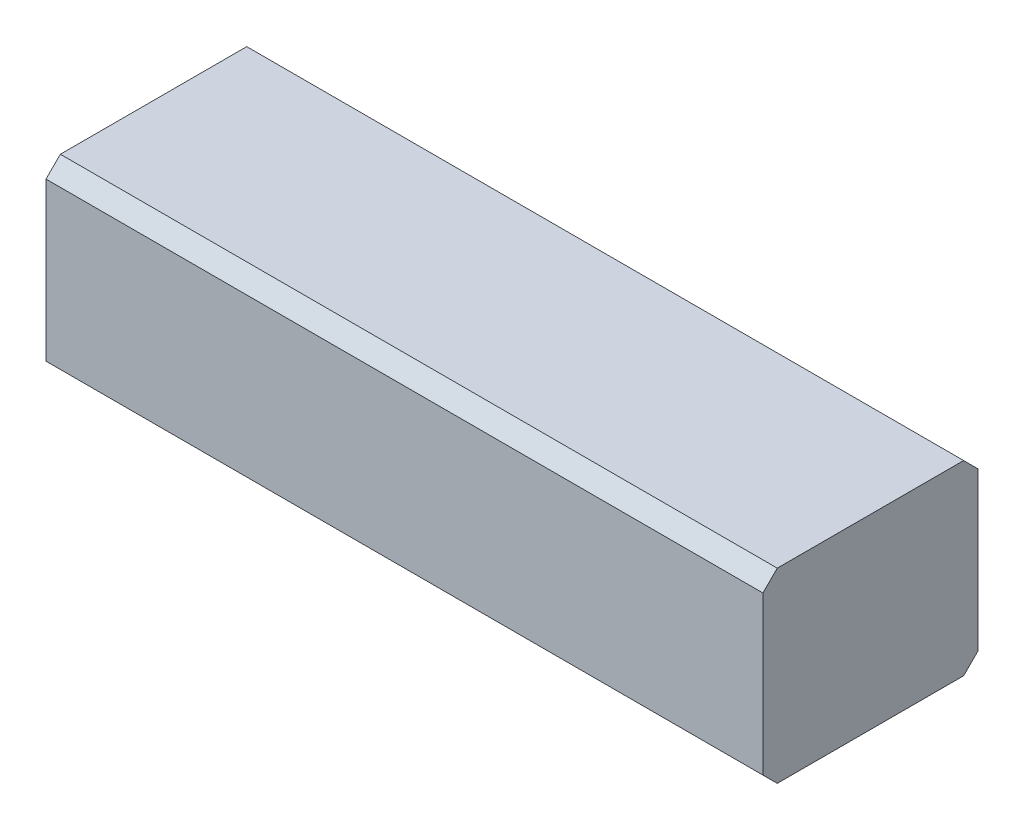
ISO-10303-21;
HEADER;
FILE_DESCRIPTION(('STEP AP214'),'2;1');
FILE_NAME('part.step','',(''),(''),'','','');
FILE_SCHEMA(('AUTOMOTIVE_DESIGN { 1 0 10303 214 1 1 1 1 }'));
ENDSEC;
DATA;
#1=APPLICATION_CONTEXT('core data for automotive mechanical design processes');
#2=APPLICATION_PROTOCOL_DEFINITION('international standard','automotive_design',2000,#1);
#3=PRODUCT_CONTEXT('',#1,'mechanical');
#4=PRODUCT('Part','Part','',(#3));
#5=PRODUCT_RELATED_PRODUCT_CATEGORY('part','',(#4));
#6=PRODUCT_DEFINITION_FORMATION('','',#4);
#7=PRODUCT_DEFINITION_CONTEXT('part definition',#1,'design');
#8=PRODUCT_DEFINITION('design','',#6,#7);
#9=PRODUCT_DEFINITION_SHAPE('','',#8);
#10=(LENGTH_UNIT() NAMED_UNIT(*) SI_UNIT(.MILLI.,.METRE.));
#11=(NAMED_UNIT(*) PLANE_ANGLE_UNIT() SI_UNIT($,.RADIAN.));
#12=(NAMED_UNIT(*) SI_UNIT($,.STERADIAN.) SOLID_ANGLE_UNIT());
#13=UNCERTAINTY_MEASURE_WITH_UNIT(LENGTH_MEASURE(1.E-05),#10,'distance_accuracy_value','');
#14=(GEOMETRIC_REPRESENTATION_CONTEXT(3) GLOBAL_UNCERTAINTY_ASSIGNED_CONTEXT((#13)) GLOBAL_UNIT_ASSIGNED_CONTEXT((#10,
#11,#12)) REPRESENTATION_CONTEXT('',''));
#15=CARTESIAN_POINT('',(0.,0.,0.));
#16=DIRECTION('',(0.,0.,1.));
#17=DIRECTION('',(1.,0.,0.));
#18=AXIS2_PLACEMENT_3D('',#15,#16,#17);
#19=CARTESIAN_POINT('',(-130.,0.,-11.5));
#20=DIRECTION('',(0.,0.,1.));
#21=DIRECTION('',(0.,-1.,0.));
#22=AXIS2_PLACEMENT_3D('',#19,#20,#21);
#23=PLANE('',#22);
#24=DIRECTION('',(0.,-1.,0.));
#25=VECTOR('',#24,1.);
#26=CARTESIAN_POINT('',(-130.,0.,-11.5));
#27=LINE('',#26,#25);
#28=CARTESIAN_POINT('',(-130.,48.,-11.5));
#29=VERTEX_POINT('',#28);
#30=CARTESIAN_POINT('',(-130.,26.,-11.5));
#31=VERTEX_POINT('',#30);
#32=EDGE_CURVE('E171',#29,#31,#27,.T.);
#33=ORIENTED_EDGE('',*,*,#32,.T.);
#34=DIRECTION('',(1.,0.,0.));
#35=VECTOR('',#34,1.);
#36=CARTESIAN_POINT('',(-130.,26.,-11.5));
#37=LINE('',#36,#35);
#38=CARTESIAN_POINT('',(-30.,26.,-11.5));
#39=VERTEX_POINT('',#38);
#40=EDGE_CURVE('E223',#31,#39,#37,.T.);
#41=ORIENTED_EDGE('',*,*,#40,.T.);
#42=DIRECTION('',(0.,-1.,0.));
#43=VECTOR('',#42,1.);
#44=CARTESIAN_POINT('',(-30.,0.,-11.5));
#45=LINE('',#44,#43);
#46=CARTESIAN_POINT('',(-30.,48.,-11.5));
#47=VERTEX_POINT('',#46);
#48=EDGE_CURVE('E167',#47,#39,#45,.T.);
#49=ORIENTED_EDGE('',*,*,#48,.F.);
#50=DIRECTION('',(1.,0.,0.));
#51=VECTOR('',#50,1.);
#52=CARTESIAN_POINT('',(-130.,48.,-11.5));
#53=LINE('',#52,#51);
#54=EDGE_CURVE('E221',#29,#47,#53,.T.);
#55=ORIENTED_EDGE('',*,*,#54,.F.);
#56=EDGE_LOOP('',(#33,#41,#49,#55));
#57=FACE_BOUND('',#56,.T.);
#58=ADVANCED_FACE('F43',(#57),#23,.T.);
#59=CARTESIAN_POINT('',(-130.,18.2499999999998,18.25));
#60=DIRECTION('',(0.,0.707106781186545,0.70710678118655));
#61=DIRECTION('',(0.,-0.70710678118655,0.707106781186545));
#62=AXIS2_PLACEMENT_3D('',#59,#60,#61);
#63=PLANE('',#62);
#64=DIRECTION('',(0.,-0.70710678118655,0.707106781186545));
#65=VECTOR('',#64,1.);
#66=CARTESIAN_POINT('',(-30.,18.2499999999998,18.25));
#67=LINE('',#66,#65);
#68=CARTESIAN_POINT('',(-30.,50.,-13.5));
#69=VERTEX_POINT('',#68);
#70=EDGE_CURVE('E195',#69,#47,#67,.T.);
#71=ORIENTED_EDGE('',*,*,#70,.F.);
#72=DIRECTION('',(1.,0.,0.));
#73=VECTOR('',#72,1.);
#74=CARTESIAN_POINT('',(-130.,50.,-13.5));
#75=LINE('',#74,#73);
#76=CARTESIAN_POINT('',(-130.,50.,-13.5));
#77=VERTEX_POINT('',#76);
#78=EDGE_CURVE('E219',#77,#69,#75,.T.);
#79=ORIENTED_EDGE('',*,*,#78,.F.);
#80=DIRECTION('',(0.,-0.70710678118655,0.707106781186545));
#81=VECTOR('',#80,1.);
#82=CARTESIAN_POINT('',(-130.,18.2499999999998,18.25));
#83=LINE('',#82,#81);
#84=EDGE_CURVE('E174',#77,#29,#83,.T.);
#85=ORIENTED_EDGE('',*,*,#84,.T.);
#86=ORIENTED_EDGE('',*,*,#54,.T.);
#87=EDGE_LOOP('',(#71,#79,#85,#86));
#88=FACE_BOUND('',#87,.T.);
#89=ADVANCED_FACE('F244',(#88),#63,.T.);
#90=CARTESIAN_POINT('',(-130.,50.,0.));
#91=DIRECTION('',(0.,1.,0.));
#92=DIRECTION('',(0.,0.,1.));
#93=AXIS2_PLACEMENT_3D('',#90,#91,#92);
#94=PLANE('',#93);
#95=DIRECTION('',(0.,0.,1.));
#96=VECTOR('',#95,1.);
#97=CARTESIAN_POINT('',(-30.,50.,0.));
#98=LINE('',#97,#96);
#99=CARTESIAN_POINT('',(-30.,50.,-39.5));
#100=VERTEX_POINT('',#99);
#101=EDGE_CURVE('E198',#100,#69,#98,.T.);
#102=ORIENTED_EDGE('',*,*,#101,.F.);
#103=DIRECTION('',(1.,0.,0.));
#104=VECTOR('',#103,1.);
#105=CARTESIAN_POINT('',(-130.,50.,-39.5));
#106=LINE('',#105,#104);
#107=CARTESIAN_POINT('',(-130.,50.,-39.5));
#108=VERTEX_POINT('',#107);
#109=EDGE_CURVE('E217',#108,#100,#106,.T.);
#110=ORIENTED_EDGE('',*,*,#109,.F.);
#111=DIRECTION('',(0.,0.,1.));
#112=VECTOR('',#111,1.);
#113=CARTESIAN_POINT('',(-130.,50.,0.));
#114=LINE('',#113,#112);
#115=EDGE_CURVE('E178',#108,#77,#114,.T.);
#116=ORIENTED_EDGE('',*,*,#115,.T.);
#117=ORIENTED_EDGE('',*,*,#78,.T.);
#118=EDGE_LOOP('',(#102,#110,#116,#117));
#119=FACE_BOUND('',#118,.T.);
#120=ADVANCED_FACE('F249',(#119),#94,.T.);
#121=CARTESIAN_POINT('',(-130.,44.7500000000002,-44.7499999999999));
#122=DIRECTION('',(0.,0.70710678118655,-0.707106781186545));
#123=DIRECTION('',(0.,0.707106781186545,0.70710678118655));
#124=AXIS2_PLACEMENT_3D('',#121,#122,#123);
#125=PLANE('',#124);
#126=DIRECTION('',(0.,0.707106781186545,0.70710678118655));
#127=VECTOR('',#126,1.);
#128=CARTESIAN_POINT('',(-30.,44.7500000000002,-44.7499999999999));
#129=LINE('',#128,#127);
#130=CARTESIAN_POINT('',(-30.,48.,-41.5));
#131=VERTEX_POINT('',#130);
#132=EDGE_CURVE('E201',#131,#100,#129,.T.);
#133=ORIENTED_EDGE('',*,*,#132,.F.);
#134=DIRECTION('',(1.,0.,0.));
#135=VECTOR('',#134,1.);
#136=CARTESIAN_POINT('',(-130.,48.,-41.5));
#137=LINE('',#136,#135);
#138=CARTESIAN_POINT('',(-130.,48.,-41.5));
#139=VERTEX_POINT('',#138);
#140=EDGE_CURVE('E215',#139,#131,#137,.T.);
#141=ORIENTED_EDGE('',*,*,#140,.F.);
#142=DIRECTION('',(0.,0.707106781186545,0.70710678118655));
#143=VECTOR('',#142,1.);
#144=CARTESIAN_POINT('',(-130.,44.7500000000002,-44.7499999999999));
#145=LINE('',#144,#143);
#146=EDGE_CURVE('E181',#139,#108,#145,.T.);
#147=ORIENTED_EDGE('',*,*,#146,.T.);
#148=ORIENTED_EDGE('',*,*,#109,.T.);
#149=EDGE_LOOP('',(#133,#141,#147,#148));
#150=FACE_BOUND('',#149,.T.);
#151=ADVANCED_FACE('F252',(#150),#125,.T.);
#152=CARTESIAN_POINT('',(-130.,0.,-41.5));
#153=DIRECTION('',(0.,0.,-1.));
#154=DIRECTION('',(-1.,0.,0.));
#155=AXIS2_PLACEMENT_3D('',#152,#153,#154);
#156=PLANE('',#155);
#157=DIRECTION('',(0.,1.,0.));
#158=VECTOR('',#157,1.);
#159=CARTESIAN_POINT('',(-30.,0.,-41.5));
#160=LINE('',#159,#158);
#161=CARTESIAN_POINT('',(-30.,26.,-41.5));
#162=VERTEX_POINT('',#161);
#163=EDGE_CURVE('E204',#162,#131,#160,.T.);
#164=ORIENTED_EDGE('',*,*,#163,.F.);
#165=DIRECTION('',(1.,0.,0.));
#166=VECTOR('',#165,1.);
#167=CARTESIAN_POINT('',(-130.,26.,-41.5));
#168=LINE('',#167,#166);
#169=CARTESIAN_POINT('',(-130.,26.,-41.5));
#170=VERTEX_POINT('',#169);
#171=EDGE_CURVE('E213',#170,#162,#168,.T.);
#172=ORIENTED_EDGE('',*,*,#171,.F.);
#173=DIRECTION('',(0.,1.,0.));
#174=VECTOR('',#173,1.);
#175=CARTESIAN_POINT('',(-130.,0.,-41.5));
#176=LINE('',#175,#174);
#177=EDGE_CURVE('E184',#170,#139,#176,.T.);
#178=ORIENTED_EDGE('',*,*,#177,.T.);
#179=ORIENTED_EDGE('',*,*,#140,.T.);
#180=EDGE_LOOP('',(#164,#172,#178,#179));
#181=FACE_BOUND('',#180,.T.);
#182=ADVANCED_FACE('F256',(#181),#156,.T.);
#183=CARTESIAN_POINT('',(-130.,-7.75000000000009,-7.75000000000014));
#184=DIRECTION('',(0.,-0.707106781186545,-0.70710678118655));
#185=DIRECTION('',(0.,0.70710678118655,-0.707106781186545));
#186=AXIS2_PLACEMENT_3D('',#183,#184,#185);
#187=PLANE('',#186);
#188=DIRECTION('',(0.,0.70710678118655,-0.707106781186545));
#189=VECTOR('',#188,1.);
#190=CARTESIAN_POINT('',(-30.,-7.75000000000009,-7.75000000000014));
#191=LINE('',#190,#189);
#192=CARTESIAN_POINT('',(-30.,24.,-39.5));
#193=VERTEX_POINT('',#192);
#194=EDGE_CURVE('E207',#193,#162,#191,.T.);
#195=ORIENTED_EDGE('',*,*,#194,.F.);
#196=DIRECTION('',(1.,0.,0.));
#197=VECTOR('',#196,1.);
#198=CARTESIAN_POINT('',(-130.,24.,-39.5));
#199=LINE('',#198,#197);
#200=CARTESIAN_POINT('',(-130.,24.,-39.5));
#201=VERTEX_POINT('',#200);
#202=EDGE_CURVE('E192',#201,#193,#199,.T.);
#203=ORIENTED_EDGE('',*,*,#202,.F.);
#204=DIRECTION('',(0.,0.70710678118655,-0.707106781186545));
#205=VECTOR('',#204,1.);
#206=CARTESIAN_POINT('',(-130.,-7.75000000000009,-7.75000000000014));
#207=LINE('',#206,#205);
#208=EDGE_CURVE('E187',#201,#170,#207,.T.);
#209=ORIENTED_EDGE('',*,*,#208,.T.);
#210=ORIENTED_EDGE('',*,*,#171,.T.);
#211=EDGE_LOOP('',(#195,#203,#209,#210));
#212=FACE_BOUND('',#211,.T.);
#213=ADVANCED_FACE('F258',(#212),#187,.T.);
#214=CARTESIAN_POINT('',(-130.,24.,0.));
#215=DIRECTION('',(0.,-1.,0.));
#216=DIRECTION('',(0.,0.,-1.));
#217=AXIS2_PLACEMENT_3D('',#214,#215,#216);
#218=PLANE('',#217);
#219=DIRECTION('',(0.,0.,-1.));
#220=VECTOR('',#219,1.);
#221=CARTESIAN_POINT('',(-30.,24.,0.));
#222=LINE('',#221,#220);
#223=CARTESIAN_POINT('',(-30.,24.,-13.5));
#224=VERTEX_POINT('',#223);
#225=EDGE_CURVE('E175',#224,#193,#222,.T.);
#226=ORIENTED_EDGE('',*,*,#225,.F.);
#227=DIRECTION('',(-1.,0.,0.));
#228=VECTOR('',#227,1.);
#229=CARTESIAN_POINT('',(-130.,24.,-13.5));
#230=LINE('',#229,#228);
#231=CARTESIAN_POINT('',(-130.,24.,-13.5));
#232=VERTEX_POINT('',#231);
#233=EDGE_CURVE('E52',#224,#232,#230,.T.);
#234=ORIENTED_EDGE('',*,*,#233,.T.);
#235=DIRECTION('',(0.,0.,-1.));
#236=VECTOR('',#235,1.);
#237=CARTESIAN_POINT('',(-130.,24.,0.));
#238=LINE('',#237,#236);
#239=EDGE_CURVE('E190',#232,#201,#238,.T.);
#240=ORIENTED_EDGE('',*,*,#239,.T.);
#241=ORIENTED_EDGE('',*,*,#202,.T.);
#242=EDGE_LOOP('',(#226,#234,#240,#241));
#243=FACE_BOUND('',#242,.T.);
#244=ADVANCED_FACE('F232',(#243),#218,.T.);
#245=CARTESIAN_POINT('',(-130.,0.,0.));
#246=DIRECTION('',(-1.,0.,0.));
#247=DIRECTION('',(0.,0.,1.));
#248=AXIS2_PLACEMENT_3D('',#245,#246,#247);
#249=PLANE('',#248);
#250=DIRECTION('',(0.,-1.,0.));
#251=VECTOR('',#250,1.);
#252=CARTESIAN_POINT('',(-130.,34.,-34.));
#253=LINE('',#252,#251);
#254=CARTESIAN_POINT('',(-130.,34.,-34.));
#255=VERTEX_POINT('',#254);
#256=CARTESIAN_POINT('',(-130.,29.,-34.));
#257=VERTEX_POINT('',#256);
#258=EDGE_CURVE('E59',#255,#257,#253,.T.);
#259=ORIENTED_EDGE('',*,*,#258,.F.);
#260=DIRECTION('',(0.,0.,-1.));
#261=VECTOR('',#260,1.);
#262=CARTESIAN_POINT('',(-130.,34.,-34.));
#263=LINE('',#262,#261);
#264=CARTESIAN_POINT('',(-130.,34.,-19.));
#265=VERTEX_POINT('',#264);
#266=EDGE_CURVE('E152',#265,#255,#263,.T.);
#267=ORIENTED_EDGE('',*,*,#266,.F.);
#268=DIRECTION('',(0.,1.,0.));
#269=VECTOR('',#268,1.);
#270=CARTESIAN_POINT('',(-130.,34.,-19.));
#271=LINE('',#270,#269);
#272=CARTESIAN_POINT('',(-130.,29.,-19.));
#273=VERTEX_POINT('',#272);
#274=EDGE_CURVE('E155',#273,#265,#271,.T.);
#275=ORIENTED_EDGE('',*,*,#274,.F.);
#276=DIRECTION('',(0.,0.,1.));
#277=VECTOR('',#276,1.);
#278=CARTESIAN_POINT('',(-130.,29.,-34.));
#279=LINE('',#278,#277);
#280=EDGE_CURVE('E161',#257,#273,#279,.T.);
#281=ORIENTED_EDGE('',*,*,#280,.F.);
#282=EDGE_LOOP('',(#259,#267,#275,#281));
#283=FACE_BOUND('',#282,.T.);
#284=ORIENTED_EDGE('',*,*,#239,.F.);
#285=DIRECTION('',(0.,-0.707106781186545,-0.70710678118655));
#286=VECTOR('',#285,1.);
#287=CARTESIAN_POINT('',(-130.,18.7500000000001,-18.7499999999999));
#288=LINE('',#287,#286);
#289=EDGE_CURVE('E11',#232,#31,#288,.F.);
#290=ORIENTED_EDGE('',*,*,#289,.T.);
#291=ORIENTED_EDGE('',*,*,#32,.F.);
#292=ORIENTED_EDGE('',*,*,#84,.F.);
#293=ORIENTED_EDGE('',*,*,#115,.F.);
#294=ORIENTED_EDGE('',*,*,#146,.F.);
#295=ORIENTED_EDGE('',*,*,#177,.F.);
#296=ORIENTED_EDGE('',*,*,#208,.F.);
#297=EDGE_LOOP('',(#284,#290,#291,#292,#293,#294,#295,#296));
#298=FACE_BOUND('',#297,.T.);
#299=ADVANCED_FACE('F238',(#283,#298),#249,.T.);
#300=CARTESIAN_POINT('',(-30.,0.,0.));
#301=DIRECTION('',(-1.,0.,0.));
#302=DIRECTION('',(0.,0.,1.));
#303=AXIS2_PLACEMENT_3D('',#300,#301,#302);
#304=PLANE('',#303);
#305=ORIENTED_EDGE('',*,*,#48,.T.);
#306=DIRECTION('',(0.,0.707106781186545,0.70710678118655));
#307=VECTOR('',#306,1.);
#308=CARTESIAN_POINT('',(-30.,26.,-11.5));
#309=LINE('',#308,#307);
#310=EDGE_CURVE('E226',#39,#224,#309,.F.);
#311=ORIENTED_EDGE('',*,*,#310,.T.);
#312=ORIENTED_EDGE('',*,*,#225,.T.);
#313=ORIENTED_EDGE('',*,*,#194,.T.);
#314=ORIENTED_EDGE('',*,*,#163,.T.);
#315=ORIENTED_EDGE('',*,*,#132,.T.);
#316=ORIENTED_EDGE('',*,*,#101,.T.);
#317=ORIENTED_EDGE('',*,*,#70,.T.);
#318=EDGE_LOOP('',(#305,#311,#312,#313,#314,#315,#316,#317));
#319=FACE_BOUND('',#318,.T.);
#320=ADVANCED_FACE('F228',(#319),#304,.F.);
#321=CARTESIAN_POINT('',(-130.,26.,-11.5));
#322=DIRECTION('',(0.,0.70710678118655,-0.707106781186545));
#323=DIRECTION('',(1.,0.,0.));
#324=AXIS2_PLACEMENT_3D('',#321,#322,#323);
#325=PLANE('',#324);
#326=ORIENTED_EDGE('',*,*,#289,.F.);
#327=ORIENTED_EDGE('',*,*,#233,.F.);
#328=ORIENTED_EDGE('',*,*,#310,.F.);
#329=ORIENTED_EDGE('',*,*,#40,.F.);
#330=EDGE_LOOP('',(#326,#327,#328,#329));
#331=FACE_BOUND('',#330,.T.);
#332=ADVANCED_FACE('F46',(#331),#325,.F.);
#333=CARTESIAN_POINT('',(-120.,34.,-34.));
#334=DIRECTION('',(0.,0.,-1.));
#335=DIRECTION('',(-1.,0.,0.));
#336=AXIS2_PLACEMENT_3D('',#333,#334,#335);
#337=PLANE('',#336);
#338=ORIENTED_EDGE('',*,*,#258,.T.);
#339=DIRECTION('',(-1.,0.,0.));
#340=VECTOR('',#339,1.);
#341=CARTESIAN_POINT('',(-120.,29.,-34.));
#342=LINE('',#341,#340);
#343=CARTESIAN_POINT('',(-120.,29.,-34.));
#344=VERTEX_POINT('',#343);
#345=EDGE_CURVE('E130',#344,#257,#342,.T.);
#346=ORIENTED_EDGE('',*,*,#345,.F.);
#347=DIRECTION('',(0.,-1.,0.));
#348=VECTOR('',#347,1.);
#349=CARTESIAN_POINT('',(-120.,34.,-34.));
#350=LINE('',#349,#348);
#351=CARTESIAN_POINT('',(-120.,34.,-34.));
#352=VERTEX_POINT('',#351);
#353=EDGE_CURVE('E134',#352,#344,#350,.T.);
#354=ORIENTED_EDGE('',*,*,#353,.F.);
#355=DIRECTION('',(-1.,0.,0.));
#356=VECTOR('',#355,1.);
#357=CARTESIAN_POINT('',(-120.,34.,-34.));
#358=LINE('',#357,#356);
#359=EDGE_CURVE('E165',#352,#255,#358,.T.);
#360=ORIENTED_EDGE('',*,*,#359,.T.);
#361=EDGE_LOOP('',(#338,#346,#354,#360));
#362=FACE_BOUND('',#361,.T.);
#363=ADVANCED_FACE('F132',(#362),#337,.F.);
#364=CARTESIAN_POINT('',(-120.,34.,-34.));
#365=DIRECTION('',(0.,1.,0.));
#366=DIRECTION('',(0.,0.,1.));
#367=AXIS2_PLACEMENT_3D('',#364,#365,#366);
#368=PLANE('',#367);
#369=ORIENTED_EDGE('',*,*,#266,.T.);
#370=ORIENTED_EDGE('',*,*,#359,.F.);
#371=DIRECTION('',(0.,0.,-1.));
#372=VECTOR('',#371,1.);
#373=CARTESIAN_POINT('',(-120.,34.,-34.));
#374=LINE('',#373,#372);
#375=CARTESIAN_POINT('',(-120.,34.,-19.));
#376=VERTEX_POINT('',#375);
#377=EDGE_CURVE('E140',#376,#352,#374,.T.);
#378=ORIENTED_EDGE('',*,*,#377,.F.);
#379=DIRECTION('',(-1.,0.,0.));
#380=VECTOR('',#379,1.);
#381=CARTESIAN_POINT('',(-120.,34.,-19.));
#382=LINE('',#381,#380);
#383=EDGE_CURVE('E168',#376,#265,#382,.T.);
#384=ORIENTED_EDGE('',*,*,#383,.T.);
#385=EDGE_LOOP('',(#369,#370,#378,#384));
#386=FACE_BOUND('',#385,.T.);
#387=ADVANCED_FACE('F334',(#386),#368,.F.);
#388=CARTESIAN_POINT('',(-120.,34.,-19.));
#389=DIRECTION('',(0.,0.,1.));
#390=DIRECTION('',(0.,-1.,0.));
#391=AXIS2_PLACEMENT_3D('',#388,#389,#390);
#392=PLANE('',#391);
#393=ORIENTED_EDGE('',*,*,#274,.T.);
#394=ORIENTED_EDGE('',*,*,#383,.F.);
#395=DIRECTION('',(0.,1.,0.));
#396=VECTOR('',#395,1.);
#397=CARTESIAN_POINT('',(-120.,34.,-19.));
#398=LINE('',#397,#396);
#399=CARTESIAN_POINT('',(-120.,29.,-19.));
#400=VERTEX_POINT('',#399);
#401=EDGE_CURVE('E148',#400,#376,#398,.T.);
#402=ORIENTED_EDGE('',*,*,#401,.F.);
#403=DIRECTION('',(-1.,0.,0.));
#404=VECTOR('',#403,1.);
#405=CARTESIAN_POINT('',(-120.,29.,-19.));
#406=LINE('',#405,#404);
#407=EDGE_CURVE('E139',#400,#273,#406,.T.);
#408=ORIENTED_EDGE('',*,*,#407,.T.);
#409=EDGE_LOOP('',(#393,#394,#402,#408));
#410=FACE_BOUND('',#409,.T.);
#411=ADVANCED_FACE('F342',(#410),#392,.F.);
#412=CARTESIAN_POINT('',(-120.,29.,-34.));
#413=DIRECTION('',(0.,-1.,0.));
#414=DIRECTION('',(0.,0.,-1.));
#415=AXIS2_PLACEMENT_3D('',#412,#413,#414);
#416=PLANE('',#415);
#417=ORIENTED_EDGE('',*,*,#280,.T.);
#418=ORIENTED_EDGE('',*,*,#407,.F.);
#419=DIRECTION('',(0.,0.,1.));
#420=VECTOR('',#419,1.);
#421=CARTESIAN_POINT('',(-120.,29.,-34.));
#422=LINE('',#421,#420);
#423=EDGE_CURVE('E143',#344,#400,#422,.T.);
#424=ORIENTED_EDGE('',*,*,#423,.F.);
#425=ORIENTED_EDGE('',*,*,#345,.T.);
#426=EDGE_LOOP('',(#417,#418,#424,#425));
#427=FACE_BOUND('',#426,.T.);
#428=ADVANCED_FACE('F144',(#427),#416,.F.);
#429=CARTESIAN_POINT('',(-120.,0.,0.));
#430=DIRECTION('',(-1.,0.,0.));
#431=DIRECTION('',(0.,0.,1.));
#432=AXIS2_PLACEMENT_3D('',#429,#430,#431);
#433=PLANE('',#432);
#434=ORIENTED_EDGE('',*,*,#353,.T.);
#435=ORIENTED_EDGE('',*,*,#423,.T.);
#436=ORIENTED_EDGE('',*,*,#401,.T.);
#437=ORIENTED_EDGE('',*,*,#377,.T.);
#438=EDGE_LOOP('',(#434,#435,#436,#437));
#439=FACE_BOUND('',#438,.T.);
#440=ADVANCED_FACE('F150',(#439),#433,.T.);
#441=CLOSED_SHELL('',(#58,#89,#120,#151,#182,#213,#244,#299,#320,#332,#363,#387,#411,#428,#440));
#442=MANIFOLD_SOLID_BREP('B2',#441);
#443=ADVANCED_BREP_SHAPE_REPRESENTATION('',(#18,#442),#14);
#444=SHAPE_DEFINITION_REPRESENTATION(#9,#443);
ENDSEC;
END-ISO-10303-21;
